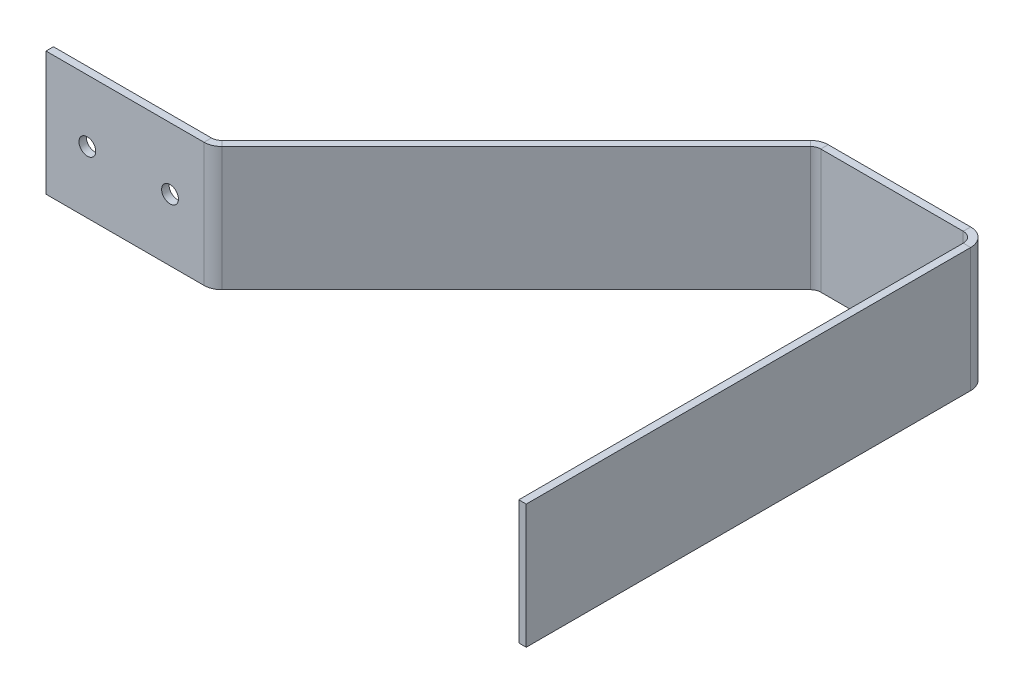
ISO-10303-21;
HEADER;
FILE_DESCRIPTION(('STEP AP214'),'2;1');
FILE_NAME('part.step','',(''),(''),'','','');
FILE_SCHEMA(('AUTOMOTIVE_DESIGN { 1 0 10303 214 1 1 1 1 }'));
ENDSEC;
DATA;
#1=APPLICATION_CONTEXT('core data for automotive mechanical design processes');
#2=APPLICATION_PROTOCOL_DEFINITION('international standard','automotive_design',2000,#1);
#3=PRODUCT_CONTEXT('',#1,'mechanical');
#4=PRODUCT('Part','Part','',(#3));
#5=PRODUCT_RELATED_PRODUCT_CATEGORY('part','',(#4));
#6=PRODUCT_DEFINITION_FORMATION('','',#4);
#7=PRODUCT_DEFINITION_CONTEXT('part definition',#1,'design');
#8=PRODUCT_DEFINITION('design','',#6,#7);
#9=PRODUCT_DEFINITION_SHAPE('','',#8);
#10=(LENGTH_UNIT() NAMED_UNIT(*) SI_UNIT(.MILLI.,.METRE.));
#11=(NAMED_UNIT(*) PLANE_ANGLE_UNIT() SI_UNIT($,.RADIAN.));
#12=(NAMED_UNIT(*) SI_UNIT($,.STERADIAN.) SOLID_ANGLE_UNIT());
#13=UNCERTAINTY_MEASURE_WITH_UNIT(LENGTH_MEASURE(1.E-05),#10,'distance_accuracy_value','');
#14=(GEOMETRIC_REPRESENTATION_CONTEXT(3) GLOBAL_UNCERTAINTY_ASSIGNED_CONTEXT((#13)) GLOBAL_UNIT_ASSIGNED_CONTEXT((#10,
#11,#12)) REPRESENTATION_CONTEXT('',''));
#15=CARTESIAN_POINT('',(0.,0.,0.));
#16=DIRECTION('',(0.,0.,1.));
#17=DIRECTION('',(1.,0.,0.));
#18=AXIS2_PLACEMENT_3D('',#15,#16,#17);
#19=CARTESIAN_POINT('',(48.5379797358805,38.1,0.));
#20=DIRECTION('',(0.,1.,0.));
#21=DIRECTION('',(0.,0.,1.));
#22=AXIS2_PLACEMENT_3D('',#19,#20,#21);
#23=PLANE('',#22);
#24=DIRECTION('',(0.,0.,-1.));
#25=VECTOR('',#24,1.);
#26=CARTESIAN_POINT('',(48.5379797358805,38.1,0.));
#27=LINE('',#26,#25);
#28=CARTESIAN_POINT('',(48.5379797358805,38.1,0.));
#29=VERTEX_POINT('',#28);
#30=CARTESIAN_POINT('',(48.5379797358805,38.1,-2.286));
#31=VERTEX_POINT('',#30);
#32=EDGE_CURVE('E11',#29,#31,#27,.T.);
#33=ORIENTED_EDGE('',*,*,#32,.F.);
#34=CARTESIAN_POINT('',(48.5379797358805,38.1,-5.461));
#35=DIRECTION('',(0.,-1.,0.));
#36=DIRECTION('',(0.,0.,-1.));
#37=AXIS2_PLACEMENT_3D('',#34,#35,#36);
#38=CIRCLE('',#37,5.461);
#39=CARTESIAN_POINT('',(52.3994898679403,38.1,-1.59948986794028));
#40=VERTEX_POINT('',#39);
#41=EDGE_CURVE('E336',#29,#40,#38,.F.);
#42=ORIENTED_EDGE('',*,*,#41,.T.);
#43=DIRECTION('',(0.707106781186549,0.,0.707106781186546));
#44=VECTOR('',#43,1.);
#45=CARTESIAN_POINT('',(50.7830437661478,38.1,-3.21593596973272));
#46=LINE('',#45,#44);
#47=CARTESIAN_POINT('',(50.7830437661478,38.1,-3.21593596973272));
#48=VERTEX_POINT('',#47);
#49=EDGE_CURVE('E47',#48,#40,#46,.T.);
#50=ORIENTED_EDGE('',*,*,#49,.F.);
#51=CARTESIAN_POINT('',(48.5379797358805,38.1,-5.461));
#52=DIRECTION('',(0.,1.,0.));
#53=DIRECTION('',(1.,0.,0.));
#54=AXIS2_PLACEMENT_3D('',#51,#52,#53);
#55=CIRCLE('',#54,3.175);
#56=EDGE_CURVE('E324',#31,#48,#55,.T.);
#57=ORIENTED_EDGE('',*,*,#56,.F.);
#58=EDGE_LOOP('',(#33,#42,#50,#57));
#59=FACE_BOUND('',#58,.T.);
#60=ADVANCED_FACE('F38',(#59),#23,.T.);
#61=CARTESIAN_POINT('',(50.7830437661478,38.1,-3.21593596973272));
#62=DIRECTION('',(0.,1.,0.));
#63=DIRECTION('',(0.,0.,1.));
#64=AXIS2_PLACEMENT_3D('',#61,#62,#63);
#65=PLANE('',#64);
#66=DIRECTION('',(1.,0.,0.));
#67=VECTOR('',#66,1.);
#68=CARTESIAN_POINT('',(0.,38.1,0.));
#69=LINE('',#68,#67);
#70=CARTESIAN_POINT('',(0.,38.1,0.));
#71=VERTEX_POINT('',#70);
#72=EDGE_CURVE('E333',#71,#29,#69,.T.);
#73=ORIENTED_EDGE('',*,*,#72,.T.);
#74=ORIENTED_EDGE('',*,*,#32,.T.);
#75=DIRECTION('',(1.,0.,0.));
#76=VECTOR('',#75,1.);
#77=CARTESIAN_POINT('',(0.,38.1,-2.286));
#78=LINE('',#77,#76);
#79=CARTESIAN_POINT('',(0.,38.1,-2.286));
#80=VERTEX_POINT('',#79);
#81=EDGE_CURVE('E327',#80,#31,#78,.T.);
#82=ORIENTED_EDGE('',*,*,#81,.F.);
#83=DIRECTION('',(0.,0.,-1.));
#84=VECTOR('',#83,1.);
#85=CARTESIAN_POINT('',(0.,38.1,0.));
#86=LINE('',#85,#84);
#87=EDGE_CURVE('E330',#71,#80,#86,.T.);
#88=ORIENTED_EDGE('',*,*,#87,.F.);
#89=EDGE_LOOP('',(#73,#74,#82,#88));
#90=FACE_BOUND('',#89,.T.);
#91=ADVANCED_FACE('F387',(#90),#65,.T.);
#92=CARTESIAN_POINT('',(52.3994898679403,0.,-1.59948986794028));
#93=DIRECTION('',(0.,-1.,0.));
#94=DIRECTION('',(0.,0.,-1.));
#95=AXIS2_PLACEMENT_3D('',#92,#93,#94);
#96=PLANE('',#95);
#97=DIRECTION('',(-0.707106781186549,0.,-0.707106781186546));
#98=VECTOR('',#97,1.);
#99=CARTESIAN_POINT('',(52.3994898679403,0.,-1.59948986794028));
#100=LINE('',#99,#98);
#101=CARTESIAN_POINT('',(52.3994898679403,0.,-1.59948986794028));
#102=VERTEX_POINT('',#101);
#103=CARTESIAN_POINT('',(50.7830437661478,0.,-3.21593596973272));
#104=VERTEX_POINT('',#103);
#105=EDGE_CURVE('E294',#102,#104,#100,.T.);
#106=ORIENTED_EDGE('',*,*,#105,.F.);
#107=CARTESIAN_POINT('',(48.5379797358805,0.,-5.461));
#108=DIRECTION('',(0.,-1.,0.));
#109=DIRECTION('',(0.,0.,-1.));
#110=AXIS2_PLACEMENT_3D('',#107,#108,#109);
#111=CIRCLE('',#110,5.461);
#112=CARTESIAN_POINT('',(48.5379797358805,0.,0.));
#113=VERTEX_POINT('',#112);
#114=EDGE_CURVE('E236',#113,#102,#111,.F.);
#115=ORIENTED_EDGE('',*,*,#114,.F.);
#116=DIRECTION('',(0.,0.,1.));
#117=VECTOR('',#116,1.);
#118=CARTESIAN_POINT('',(48.5379797358805,0.,-2.286));
#119=LINE('',#118,#117);
#120=CARTESIAN_POINT('',(48.5379797358805,0.,-2.286));
#121=VERTEX_POINT('',#120);
#122=EDGE_CURVE('E292',#121,#113,#119,.T.);
#123=ORIENTED_EDGE('',*,*,#122,.F.);
#124=CARTESIAN_POINT('',(48.5379797358805,0.,-5.461));
#125=DIRECTION('',(0.,1.,0.));
#126=DIRECTION('',(1.,0.,0.));
#127=AXIS2_PLACEMENT_3D('',#124,#125,#126);
#128=CIRCLE('',#127,3.175);
#129=EDGE_CURVE('E224',#121,#104,#128,.T.);
#130=ORIENTED_EDGE('',*,*,#129,.T.);
#131=EDGE_LOOP('',(#106,#115,#123,#130));
#132=FACE_BOUND('',#131,.T.);
#133=ADVANCED_FACE('F392',(#132),#96,.T.);
#134=CARTESIAN_POINT('',(48.5379797358805,0.,-2.286));
#135=DIRECTION('',(0.,-1.,0.));
#136=DIRECTION('',(0.,0.,-1.));
#137=AXIS2_PLACEMENT_3D('',#134,#135,#136);
#138=PLANE('',#137);
#139=DIRECTION('',(0.707106781186546,0.,-0.707106781186549));
#140=VECTOR('',#139,1.);
#141=CARTESIAN_POINT('',(50.8,0.,0.));
#142=LINE('',#141,#140);
#143=CARTESIAN_POINT('',(142.8070646762,0.,-92.0070646762005));
#144=VERTEX_POINT('',#143);
#145=EDGE_CURVE('E239',#102,#144,#142,.T.);
#146=ORIENTED_EDGE('',*,*,#145,.F.);
#147=ORIENTED_EDGE('',*,*,#105,.T.);
#148=DIRECTION('',(0.707106781186546,0.,-0.707106781186549));
#149=VECTOR('',#148,1.);
#150=CARTESIAN_POINT('',(49.1835538982075,0.,-1.61644610179244));
#151=LINE('',#150,#149);
#152=CARTESIAN_POINT('',(141.190618574408,0.,-93.6235107779929));
#153=VERTEX_POINT('',#152);
#154=EDGE_CURVE('E221',#104,#153,#151,.T.);
#155=ORIENTED_EDGE('',*,*,#154,.T.);
#156=DIRECTION('',(0.707106781186541,0.,0.707106781186554));
#157=VECTOR('',#156,1.);
#158=CARTESIAN_POINT('',(141.190618574408,0.,-93.6235107779929));
#159=LINE('',#158,#157);
#160=EDGE_CURVE('E288',#153,#144,#159,.T.);
#161=ORIENTED_EDGE('',*,*,#160,.T.);
#162=EDGE_LOOP('',(#146,#147,#155,#161));
#163=FACE_BOUND('',#162,.T.);
#164=ADVANCED_FACE('F409',(#163),#138,.T.);
#165=CARTESIAN_POINT('',(142.8070646762,38.1,-92.0070646762005));
#166=DIRECTION('',(0.,1.,0.));
#167=DIRECTION('',(0.,0.,1.));
#168=AXIS2_PLACEMENT_3D('',#165,#166,#167);
#169=PLANE('',#168);
#170=DIRECTION('',(-0.707106781186541,0.,-0.707106781186554));
#171=VECTOR('',#170,1.);
#172=CARTESIAN_POINT('',(142.8070646762,38.1,-92.0070646762005));
#173=LINE('',#172,#171);
#174=CARTESIAN_POINT('',(142.8070646762,38.1,-92.0070646762005));
#175=VERTEX_POINT('',#174);
#176=CARTESIAN_POINT('',(141.190618574408,38.1,-93.6235107779929));
#177=VERTEX_POINT('',#176);
#178=EDGE_CURVE('E173',#175,#177,#173,.T.);
#179=ORIENTED_EDGE('',*,*,#178,.F.);
#180=CARTESIAN_POINT('',(145.052128706467,38.1,-89.7620006459331));
#181=DIRECTION('',(0.,1.,0.));
#182=DIRECTION('',(0.,0.,1.));
#183=AXIS2_PLACEMENT_3D('',#180,#181,#182);
#184=CIRCLE('',#183,3.175);
#185=CARTESIAN_POINT('',(145.052128706467,38.1,-92.9370006459331));
#186=VERTEX_POINT('',#185);
#187=EDGE_CURVE('E177',#175,#186,#184,.F.);
#188=ORIENTED_EDGE('',*,*,#187,.T.);
#189=DIRECTION('',(0.,0.,1.));
#190=VECTOR('',#189,1.);
#191=CARTESIAN_POINT('',(145.052128706467,38.1,-95.2230006459331));
#192=LINE('',#191,#190);
#193=CARTESIAN_POINT('',(145.052128706467,38.1,-95.2230006459331));
#194=VERTEX_POINT('',#193);
#195=EDGE_CURVE('E161',#194,#186,#192,.T.);
#196=ORIENTED_EDGE('',*,*,#195,.F.);
#197=CARTESIAN_POINT('',(145.052128706467,38.1,-89.7620006459331));
#198=DIRECTION('',(0.,1.,0.));
#199=DIRECTION('',(1.,0.,0.));
#200=AXIS2_PLACEMENT_3D('',#197,#198,#199);
#201=CIRCLE('',#200,5.461);
#202=EDGE_CURVE('E319',#177,#194,#201,.F.);
#203=ORIENTED_EDGE('',*,*,#202,.F.);
#204=EDGE_LOOP('',(#179,#188,#196,#203));
#205=FACE_BOUND('',#204,.T.);
#206=ADVANCED_FACE('F179',(#205),#169,.T.);
#207=CARTESIAN_POINT('',(145.052128706467,38.1,-95.2230006459331));
#208=DIRECTION('',(0.,1.,0.));
#209=DIRECTION('',(0.,0.,1.));
#210=AXIS2_PLACEMENT_3D('',#207,#208,#209);
#211=PLANE('',#210);
#212=DIRECTION('',(0.707106781186546,0.,-0.707106781186549));
#213=VECTOR('',#212,1.);
#214=CARTESIAN_POINT('',(50.8,38.1,0.));
#215=LINE('',#214,#213);
#216=EDGE_CURVE('E183',#40,#175,#215,.T.);
#217=ORIENTED_EDGE('',*,*,#216,.T.);
#218=ORIENTED_EDGE('',*,*,#178,.T.);
#219=DIRECTION('',(0.707106781186546,0.,-0.707106781186549));
#220=VECTOR('',#219,1.);
#221=CARTESIAN_POINT('',(49.1835538982075,38.1,-1.61644610179244));
#222=LINE('',#221,#220);
#223=EDGE_CURVE('E321',#48,#177,#222,.T.);
#224=ORIENTED_EDGE('',*,*,#223,.F.);
#225=ORIENTED_EDGE('',*,*,#49,.T.);
#226=EDGE_LOOP('',(#217,#218,#224,#225));
#227=FACE_BOUND('',#226,.T.);
#228=ADVANCED_FACE('F341',(#227),#211,.T.);
#229=CARTESIAN_POINT('',(145.052128706467,0.,-92.9370006459331));
#230=DIRECTION('',(0.,-1.,0.));
#231=DIRECTION('',(0.,0.,-1.));
#232=AXIS2_PLACEMENT_3D('',#229,#230,#231);
#233=PLANE('',#232);
#234=DIRECTION('',(0.,0.,-1.));
#235=VECTOR('',#234,1.);
#236=CARTESIAN_POINT('',(145.052128706467,0.,-92.9370006459331));
#237=LINE('',#236,#235);
#238=CARTESIAN_POINT('',(145.052128706467,0.,-92.9370006459331));
#239=VERTEX_POINT('',#238);
#240=CARTESIAN_POINT('',(145.052128706467,0.,-95.2230006459331));
#241=VERTEX_POINT('',#240);
#242=EDGE_CURVE('E174',#239,#241,#237,.T.);
#243=ORIENTED_EDGE('',*,*,#242,.F.);
#244=CARTESIAN_POINT('',(145.052128706467,0.,-89.7620006459331));
#245=DIRECTION('',(0.,1.,0.));
#246=DIRECTION('',(0.,0.,1.));
#247=AXIS2_PLACEMENT_3D('',#244,#245,#246);
#248=CIRCLE('',#247,3.175);
#249=EDGE_CURVE('E190',#144,#239,#248,.F.);
#250=ORIENTED_EDGE('',*,*,#249,.F.);
#251=ORIENTED_EDGE('',*,*,#160,.F.);
#252=CARTESIAN_POINT('',(145.052128706467,0.,-89.7620006459331));
#253=DIRECTION('',(0.,1.,0.));
#254=DIRECTION('',(1.,0.,0.));
#255=AXIS2_PLACEMENT_3D('',#252,#253,#254);
#256=CIRCLE('',#255,5.461);
#257=EDGE_CURVE('E218',#153,#241,#256,.F.);
#258=ORIENTED_EDGE('',*,*,#257,.T.);
#259=EDGE_LOOP('',(#243,#250,#251,#258));
#260=FACE_BOUND('',#259,.T.);
#261=ADVANCED_FACE('F348',(#260),#233,.T.);
#262=CARTESIAN_POINT('',(141.190618574408,0.,-93.6235107779929));
#263=DIRECTION('',(0.,-1.,0.));
#264=DIRECTION('',(0.,0.,-1.));
#265=AXIS2_PLACEMENT_3D('',#262,#263,#264);
#266=PLANE('',#265);
#267=DIRECTION('',(1.,0.,0.));
#268=VECTOR('',#267,1.);
#269=CARTESIAN_POINT('',(143.737000645933,0.,-92.9370006459331));
#270=LINE('',#269,#268);
#271=CARTESIAN_POINT('',(188.822000645933,0.,-92.9370006459331));
#272=VERTEX_POINT('',#271);
#273=EDGE_CURVE('E243',#239,#272,#270,.T.);
#274=ORIENTED_EDGE('',*,*,#273,.F.);
#275=ORIENTED_EDGE('',*,*,#242,.T.);
#276=DIRECTION('',(1.,0.,0.));
#277=VECTOR('',#276,1.);
#278=CARTESIAN_POINT('',(143.737000645933,0.,-95.2230006459331));
#279=LINE('',#278,#277);
#280=CARTESIAN_POINT('',(188.822000645933,0.,-95.2230006459331));
#281=VERTEX_POINT('',#280);
#282=EDGE_CURVE('E216',#241,#281,#279,.T.);
#283=ORIENTED_EDGE('',*,*,#282,.T.);
#284=DIRECTION('',(0.,0.,1.));
#285=VECTOR('',#284,1.);
#286=CARTESIAN_POINT('',(188.822000645933,0.,-95.2230006459331));
#287=LINE('',#286,#285);
#288=EDGE_CURVE('E109',#281,#272,#287,.T.);
#289=ORIENTED_EDGE('',*,*,#288,.T.);
#290=EDGE_LOOP('',(#274,#275,#283,#289));
#291=FACE_BOUND('',#290,.T.);
#292=ADVANCED_FACE('F350',(#291),#266,.T.);
#293=CARTESIAN_POINT('',(188.822000645933,38.1,-92.9370006459331));
#294=DIRECTION('',(0.,1.,0.));
#295=DIRECTION('',(0.,0.,1.));
#296=AXIS2_PLACEMENT_3D('',#293,#294,#295);
#297=PLANE('',#296);
#298=DIRECTION('',(0.,0.,-1.));
#299=VECTOR('',#298,1.);
#300=CARTESIAN_POINT('',(188.822000645933,38.1,-92.9370006459331));
#301=LINE('',#300,#299);
#302=CARTESIAN_POINT('',(188.822000645933,38.1,-92.9370006459331));
#303=VERTEX_POINT('',#302);
#304=CARTESIAN_POINT('',(188.822000645933,38.1,-95.2230006459331));
#305=VERTEX_POINT('',#304);
#306=EDGE_CURVE('E286',#303,#305,#301,.T.);
#307=ORIENTED_EDGE('',*,*,#306,.F.);
#308=CARTESIAN_POINT('',(188.822000645933,38.1,-89.7620006459331));
#309=DIRECTION('',(0.,1.,0.));
#310=DIRECTION('',(0.,0.,1.));
#311=AXIS2_PLACEMENT_3D('',#308,#309,#310);
#312=CIRCLE('',#311,3.175);
#313=CARTESIAN_POINT('',(191.997000645933,38.1,-89.7620006459331));
#314=VERTEX_POINT('',#313);
#315=EDGE_CURVE('E198',#303,#314,#312,.F.);
#316=ORIENTED_EDGE('',*,*,#315,.T.);
#317=DIRECTION('',(-1.,0.,0.));
#318=VECTOR('',#317,1.);
#319=CARTESIAN_POINT('',(194.283000645933,38.1,-89.7620006459331));
#320=LINE('',#319,#318);
#321=CARTESIAN_POINT('',(194.283000645933,38.1,-89.7620006459331));
#322=VERTEX_POINT('',#321);
#323=EDGE_CURVE('E56',#322,#314,#320,.T.);
#324=ORIENTED_EDGE('',*,*,#323,.F.);
#325=CARTESIAN_POINT('',(188.822000645933,38.1,-89.7620006459331));
#326=DIRECTION('',(0.,1.,0.));
#327=DIRECTION('',(1.,0.,0.));
#328=AXIS2_PLACEMENT_3D('',#325,#326,#327);
#329=CIRCLE('',#328,5.461);
#330=EDGE_CURVE('E315',#305,#322,#329,.F.);
#331=ORIENTED_EDGE('',*,*,#330,.F.);
#332=EDGE_LOOP('',(#307,#316,#324,#331));
#333=FACE_BOUND('',#332,.T.);
#334=ADVANCED_FACE('F565',(#333),#297,.T.);
#335=CARTESIAN_POINT('',(194.283000645933,38.1,-89.7620006459331));
#336=DIRECTION('',(0.,1.,0.));
#337=DIRECTION('',(0.,0.,1.));
#338=AXIS2_PLACEMENT_3D('',#335,#336,#337);
#339=PLANE('',#338);
#340=DIRECTION('',(1.,0.,0.));
#341=VECTOR('',#340,1.);
#342=CARTESIAN_POINT('',(143.737000645933,38.1,-92.9370006459331));
#343=LINE('',#342,#341);
#344=EDGE_CURVE('E165',#186,#303,#343,.T.);
#345=ORIENTED_EDGE('',*,*,#344,.T.);
#346=ORIENTED_EDGE('',*,*,#306,.T.);
#347=DIRECTION('',(1.,0.,0.));
#348=VECTOR('',#347,1.);
#349=CARTESIAN_POINT('',(143.737000645933,38.1,-95.2230006459331));
#350=LINE('',#349,#348);
#351=EDGE_CURVE('E168',#194,#305,#350,.T.);
#352=ORIENTED_EDGE('',*,*,#351,.F.);
#353=ORIENTED_EDGE('',*,*,#195,.T.);
#354=EDGE_LOOP('',(#345,#346,#352,#353));
#355=FACE_BOUND('',#354,.T.);
#356=ADVANCED_FACE('F163',(#355),#339,.T.);
#357=CARTESIAN_POINT('',(191.997000645933,0.,-89.7620006459331));
#358=DIRECTION('',(0.,-1.,0.));
#359=DIRECTION('',(0.,0.,-1.));
#360=AXIS2_PLACEMENT_3D('',#357,#358,#359);
#361=PLANE('',#360);
#362=DIRECTION('',(1.,0.,0.));
#363=VECTOR('',#362,1.);
#364=CARTESIAN_POINT('',(191.997000645933,0.,-89.7620006459331));
#365=LINE('',#364,#363);
#366=CARTESIAN_POINT('',(191.997000645933,0.,-89.7620006459331));
#367=VERTEX_POINT('',#366);
#368=CARTESIAN_POINT('',(194.283000645933,0.,-89.7620006459331));
#369=VERTEX_POINT('',#368);
#370=EDGE_CURVE('E116',#367,#369,#365,.T.);
#371=ORIENTED_EDGE('',*,*,#370,.F.);
#372=CARTESIAN_POINT('',(188.822000645933,0.,-89.7620006459331));
#373=DIRECTION('',(0.,1.,0.));
#374=DIRECTION('',(0.,0.,1.));
#375=AXIS2_PLACEMENT_3D('',#372,#373,#374);
#376=CIRCLE('',#375,3.175);
#377=EDGE_CURVE('E245',#272,#367,#376,.F.);
#378=ORIENTED_EDGE('',*,*,#377,.F.);
#379=ORIENTED_EDGE('',*,*,#288,.F.);
#380=CARTESIAN_POINT('',(188.822000645933,0.,-89.7620006459331));
#381=DIRECTION('',(0.,1.,0.));
#382=DIRECTION('',(1.,0.,0.));
#383=AXIS2_PLACEMENT_3D('',#380,#381,#382);
#384=CIRCLE('',#383,5.461);
#385=EDGE_CURVE('E214',#281,#369,#384,.F.);
#386=ORIENTED_EDGE('',*,*,#385,.T.);
#387=EDGE_LOOP('',(#371,#378,#379,#386));
#388=FACE_BOUND('',#387,.T.);
#389=ADVANCED_FACE('F363',(#388),#361,.T.);
#390=CARTESIAN_POINT('',(188.822000645933,0.,-95.2230006459331));
#391=DIRECTION('',(0.,-1.,0.));
#392=DIRECTION('',(0.,0.,-1.));
#393=AXIS2_PLACEMENT_3D('',#390,#391,#392);
#394=PLANE('',#393);
#395=DIRECTION('',(0.,0.,1.));
#396=VECTOR('',#395,1.);
#397=CARTESIAN_POINT('',(191.997000645933,0.,-92.9370006459331));
#398=LINE('',#397,#396);
#399=CARTESIAN_POINT('',(191.997000645933,0.,46.7629993540669));
#400=VERTEX_POINT('',#399);
#401=EDGE_CURVE('E204',#367,#400,#398,.T.);
#402=ORIENTED_EDGE('',*,*,#401,.F.);
#403=ORIENTED_EDGE('',*,*,#370,.T.);
#404=DIRECTION('',(0.,0.,-1.));
#405=VECTOR('',#404,1.);
#406=CARTESIAN_POINT('',(194.283000645933,0.,-92.9370006459331));
#407=LINE('',#406,#405);
#408=CARTESIAN_POINT('',(194.283000645933,0.,46.7629993540669));
#409=VERTEX_POINT('',#408);
#410=EDGE_CURVE('E211',#369,#409,#407,.F.);
#411=ORIENTED_EDGE('',*,*,#410,.T.);
#412=DIRECTION('',(-1.,0.,0.));
#413=VECTOR('',#412,1.);
#414=CARTESIAN_POINT('',(194.283000645933,0.,46.7629993540669));
#415=LINE('',#414,#413);
#416=EDGE_CURVE('E207',#409,#400,#415,.T.);
#417=ORIENTED_EDGE('',*,*,#416,.T.);
#418=EDGE_LOOP('',(#402,#403,#411,#417));
#419=FACE_BOUND('',#418,.T.);
#420=ADVANCED_FACE('F371',(#419),#394,.T.);
#421=CARTESIAN_POINT('',(191.997000645933,38.1,-92.9370006459331));
#422=DIRECTION('',(1.,0.,0.));
#423=DIRECTION('',(0.,0.,-1.));
#424=AXIS2_PLACEMENT_3D('',#421,#422,#423);
#425=PLANE('',#424);
#426=ORIENTED_EDGE('',*,*,#401,.T.);
#427=DIRECTION('',(0.,-1.,0.));
#428=VECTOR('',#427,1.);
#429=CARTESIAN_POINT('',(191.997000645933,38.1,46.7629993540669));
#430=LINE('',#429,#428);
#431=CARTESIAN_POINT('',(191.997000645933,38.1,46.7629993540669));
#432=VERTEX_POINT('',#431);
#433=EDGE_CURVE('E281',#432,#400,#430,.T.);
#434=ORIENTED_EDGE('',*,*,#433,.F.);
#435=DIRECTION('',(0.,0.,1.));
#436=VECTOR('',#435,1.);
#437=CARTESIAN_POINT('',(191.997000645933,38.1,-92.9370006459331));
#438=LINE('',#437,#436);
#439=EDGE_CURVE('E122',#314,#432,#438,.T.);
#440=ORIENTED_EDGE('',*,*,#439,.F.);
#441=DIRECTION('',(0.,-1.,0.));
#442=VECTOR('',#441,1.);
#443=CARTESIAN_POINT('',(191.997000645933,38.1,-89.7620006459331));
#444=LINE('',#443,#442);
#445=EDGE_CURVE('E200',#314,#367,#444,.T.);
#446=ORIENTED_EDGE('',*,*,#445,.T.);
#447=EDGE_LOOP('',(#426,#434,#440,#446));
#448=FACE_BOUND('',#447,.T.);
#449=ADVANCED_FACE('F369',(#448),#425,.F.);
#450=CARTESIAN_POINT('',(194.283000645933,38.1,46.7629993540669));
#451=DIRECTION('',(0.,0.,1.));
#452=DIRECTION('',(1.,0.,0.));
#453=AXIS2_PLACEMENT_3D('',#450,#451,#452);
#454=PLANE('',#453);
#455=ORIENTED_EDGE('',*,*,#416,.F.);
#456=DIRECTION('',(0.,-1.,0.));
#457=VECTOR('',#456,1.);
#458=CARTESIAN_POINT('',(194.283000645933,38.1,46.7629993540669));
#459=LINE('',#458,#457);
#460=CARTESIAN_POINT('',(194.283000645933,38.1,46.7629993540669));
#461=VERTEX_POINT('',#460);
#462=EDGE_CURVE('E279',#461,#409,#459,.T.);
#463=ORIENTED_EDGE('',*,*,#462,.F.);
#464=DIRECTION('',(-1.,0.,0.));
#465=VECTOR('',#464,1.);
#466=CARTESIAN_POINT('',(194.283000645933,38.1,46.7629993540669));
#467=LINE('',#466,#465);
#468=EDGE_CURVE('E309',#461,#432,#467,.T.);
#469=ORIENTED_EDGE('',*,*,#468,.T.);
#470=ORIENTED_EDGE('',*,*,#433,.T.);
#471=EDGE_LOOP('',(#455,#463,#469,#470));
#472=FACE_BOUND('',#471,.T.);
#473=ADVANCED_FACE('F374',(#472),#454,.T.);
#474=CARTESIAN_POINT('',(194.283000645933,38.1,-92.9370006459331));
#475=DIRECTION('',(1.,0.,0.));
#476=DIRECTION('',(0.,0.,-1.));
#477=AXIS2_PLACEMENT_3D('',#474,#475,#476);
#478=PLANE('',#477);
#479=ORIENTED_EDGE('',*,*,#410,.F.);
#480=DIRECTION('',(0.,-1.,0.));
#481=VECTOR('',#480,1.);
#482=CARTESIAN_POINT('',(194.283000645933,38.1,-89.7620006459331));
#483=LINE('',#482,#481);
#484=EDGE_CURVE('E276',#322,#369,#483,.T.);
#485=ORIENTED_EDGE('',*,*,#484,.F.);
#486=DIRECTION('',(0.,0.,-1.));
#487=VECTOR('',#486,1.);
#488=CARTESIAN_POINT('',(194.283000645933,38.1,-92.9370006459331));
#489=LINE('',#488,#487);
#490=EDGE_CURVE('E312',#322,#461,#489,.F.);
#491=ORIENTED_EDGE('',*,*,#490,.T.);
#492=ORIENTED_EDGE('',*,*,#462,.T.);
#493=EDGE_LOOP('',(#479,#485,#491,#492));
#494=FACE_BOUND('',#493,.T.);
#495=ADVANCED_FACE('F377',(#494),#478,.T.);
#496=CARTESIAN_POINT('',(188.822000645933,38.1,-89.7620006459331));
#497=DIRECTION('',(0.,-1.,0.));
#498=DIRECTION('',(0.,0.,-1.));
#499=AXIS2_PLACEMENT_3D('',#496,#497,#498);
#500=CYLINDRICAL_SURFACE('',#499,5.461);
#501=ORIENTED_EDGE('',*,*,#385,.F.);
#502=DIRECTION('',(0.,-1.,0.));
#503=VECTOR('',#502,1.);
#504=CARTESIAN_POINT('',(188.822000645933,38.1,-95.2230006459331));
#505=LINE('',#504,#503);
#506=EDGE_CURVE('E273',#305,#281,#505,.T.);
#507=ORIENTED_EDGE('',*,*,#506,.F.);
#508=ORIENTED_EDGE('',*,*,#330,.T.);
#509=ORIENTED_EDGE('',*,*,#484,.T.);
#510=EDGE_LOOP('',(#501,#507,#508,#509));
#511=FACE_BOUND('',#510,.T.);
#512=ADVANCED_FACE('F360',(#511),#500,.T.);
#513=CARTESIAN_POINT('',(143.737000645933,38.1,-95.2230006459331));
#514=DIRECTION('',(0.,0.,-1.));
#515=DIRECTION('',(-1.,0.,0.));
#516=AXIS2_PLACEMENT_3D('',#513,#514,#515);
#517=PLANE('',#516);
#518=ORIENTED_EDGE('',*,*,#282,.F.);
#519=DIRECTION('',(0.,-1.,0.));
#520=VECTOR('',#519,1.);
#521=CARTESIAN_POINT('',(145.052128706467,38.1,-95.2230006459331));
#522=LINE('',#521,#520);
#523=EDGE_CURVE('E270',#194,#241,#522,.T.);
#524=ORIENTED_EDGE('',*,*,#523,.F.);
#525=ORIENTED_EDGE('',*,*,#351,.T.);
#526=ORIENTED_EDGE('',*,*,#506,.T.);
#527=EDGE_LOOP('',(#518,#524,#525,#526));
#528=FACE_BOUND('',#527,.T.);
#529=ADVANCED_FACE('F355',(#528),#517,.T.);
#530=CARTESIAN_POINT('',(145.052128706467,38.1,-89.7620006459331));
#531=DIRECTION('',(0.,-1.,0.));
#532=DIRECTION('',(0.,0.,-1.));
#533=AXIS2_PLACEMENT_3D('',#530,#531,#532);
#534=CYLINDRICAL_SURFACE('',#533,5.461);
#535=ORIENTED_EDGE('',*,*,#257,.F.);
#536=DIRECTION('',(0.,-1.,0.));
#537=VECTOR('',#536,1.);
#538=CARTESIAN_POINT('',(141.190618574408,38.1,-93.6235107779929));
#539=LINE('',#538,#537);
#540=EDGE_CURVE('E267',#177,#153,#539,.T.);
#541=ORIENTED_EDGE('',*,*,#540,.F.);
#542=ORIENTED_EDGE('',*,*,#202,.T.);
#543=ORIENTED_EDGE('',*,*,#523,.T.);
#544=EDGE_LOOP('',(#535,#541,#542,#543));
#545=FACE_BOUND('',#544,.T.);
#546=ADVANCED_FACE('F353',(#545),#534,.T.);
#547=CARTESIAN_POINT('',(49.1835538982075,38.1,-1.61644610179244));
#548=DIRECTION('',(-0.707106781186549,0.,-0.707106781186546));
#549=DIRECTION('',(-0.707106781186546,0.,0.707106781186549));
#550=AXIS2_PLACEMENT_3D('',#547,#548,#549);
#551=PLANE('',#550);
#552=ORIENTED_EDGE('',*,*,#154,.F.);
#553=DIRECTION('',(0.,-1.,0.));
#554=VECTOR('',#553,1.);
#555=CARTESIAN_POINT('',(50.7830437661478,38.1,-3.21593596973272));
#556=LINE('',#555,#554);
#557=EDGE_CURVE('E264',#48,#104,#556,.T.);
#558=ORIENTED_EDGE('',*,*,#557,.F.);
#559=ORIENTED_EDGE('',*,*,#223,.T.);
#560=ORIENTED_EDGE('',*,*,#540,.T.);
#561=EDGE_LOOP('',(#552,#558,#559,#560));
#562=FACE_BOUND('',#561,.T.);
#563=ADVANCED_FACE('F413',(#562),#551,.T.);
#564=CARTESIAN_POINT('',(48.5379797358805,38.1,-5.461));
#565=DIRECTION('',(0.,-1.,0.));
#566=DIRECTION('',(0.,0.,-1.));
#567=AXIS2_PLACEMENT_3D('',#564,#565,#566);
#568=CYLINDRICAL_SURFACE('',#567,3.175);
#569=ORIENTED_EDGE('',*,*,#129,.F.);
#570=DIRECTION('',(0.,-1.,0.));
#571=VECTOR('',#570,1.);
#572=CARTESIAN_POINT('',(48.5379797358805,38.1,-2.286));
#573=LINE('',#572,#571);
#574=EDGE_CURVE('E261',#31,#121,#573,.T.);
#575=ORIENTED_EDGE('',*,*,#574,.F.);
#576=ORIENTED_EDGE('',*,*,#56,.T.);
#577=ORIENTED_EDGE('',*,*,#557,.T.);
#578=EDGE_LOOP('',(#569,#575,#576,#577));
#579=FACE_BOUND('',#578,.T.);
#580=ADVANCED_FACE('F417',(#579),#568,.F.);
#581=CARTESIAN_POINT('',(0.,38.1,-2.286));
#582=DIRECTION('',(0.,0.,-1.));
#583=DIRECTION('',(-1.,0.,0.));
#584=AXIS2_PLACEMENT_3D('',#581,#582,#583);
#585=PLANE('',#584);
#586=CARTESIAN_POINT('',(38.1,19.05,-2.286));
#587=DIRECTION('',(0.,0.,-1.));
#588=DIRECTION('',(-1.,0.,0.));
#589=AXIS2_PLACEMENT_3D('',#586,#587,#588);
#590=CIRCLE('',#589,2.5796875);
#591=CARTESIAN_POINT('',(35.5203125,19.05,-2.286));
#592=VERTEX_POINT('',#591);
#593=EDGE_CURVE('E305',#592,#592,#590,.T.);
#594=ORIENTED_EDGE('',*,*,#593,.F.);
#595=EDGE_LOOP('',(#594));
#596=FACE_BOUND('',#595,.T.);
#597=CARTESIAN_POINT('',(12.7,19.05,-2.286));
#598=DIRECTION('',(0.,0.,-1.));
#599=DIRECTION('',(-1.,0.,0.));
#600=AXIS2_PLACEMENT_3D('',#597,#598,#599);
#601=CIRCLE('',#600,2.5796875);
#602=CARTESIAN_POINT('',(10.1203125,19.05,-2.286));
#603=VERTEX_POINT('',#602);
#604=EDGE_CURVE('E297',#603,#603,#601,.T.);
#605=ORIENTED_EDGE('',*,*,#604,.F.);
#606=EDGE_LOOP('',(#605));
#607=FACE_BOUND('',#606,.T.);
#608=DIRECTION('',(1.,0.,0.));
#609=VECTOR('',#608,1.);
#610=CARTESIAN_POINT('',(0.,0.,-2.286));
#611=LINE('',#610,#609);
#612=CARTESIAN_POINT('',(0.,0.,-2.286));
#613=VERTEX_POINT('',#612);
#614=EDGE_CURVE('E227',#613,#121,#611,.T.);
#615=ORIENTED_EDGE('',*,*,#614,.F.);
#616=DIRECTION('',(0.,-1.,0.));
#617=VECTOR('',#616,1.);
#618=CARTESIAN_POINT('',(0.,38.1,-2.286));
#619=LINE('',#618,#617);
#620=EDGE_CURVE('E259',#80,#613,#619,.T.);
#621=ORIENTED_EDGE('',*,*,#620,.F.);
#622=ORIENTED_EDGE('',*,*,#81,.T.);
#623=ORIENTED_EDGE('',*,*,#574,.T.);
#624=EDGE_LOOP('',(#615,#621,#622,#623));
#625=FACE_BOUND('',#624,.T.);
#626=ADVANCED_FACE('F423',(#596,#607,#625),#585,.T.);
#627=CARTESIAN_POINT('',(0.,38.1,0.));
#628=DIRECTION('',(-1.,0.,0.));
#629=DIRECTION('',(0.,0.,1.));
#630=AXIS2_PLACEMENT_3D('',#627,#628,#629);
#631=PLANE('',#630);
#632=DIRECTION('',(0.,0.,-1.));
#633=VECTOR('',#632,1.);
#634=CARTESIAN_POINT('',(0.,0.,0.));
#635=LINE('',#634,#633);
#636=CARTESIAN_POINT('',(0.,0.,0.));
#637=VERTEX_POINT('',#636);
#638=EDGE_CURVE('E230',#637,#613,#635,.T.);
#639=ORIENTED_EDGE('',*,*,#638,.F.);
#640=DIRECTION('',(0.,-1.,0.));
#641=VECTOR('',#640,1.);
#642=CARTESIAN_POINT('',(0.,38.1,0.));
#643=LINE('',#642,#641);
#644=EDGE_CURVE('E257',#71,#637,#643,.T.);
#645=ORIENTED_EDGE('',*,*,#644,.F.);
#646=ORIENTED_EDGE('',*,*,#87,.T.);
#647=ORIENTED_EDGE('',*,*,#620,.T.);
#648=EDGE_LOOP('',(#639,#645,#646,#647));
#649=FACE_BOUND('',#648,.T.);
#650=ADVANCED_FACE('F425',(#649),#631,.T.);
#651=CARTESIAN_POINT('',(0.,38.1,0.));
#652=DIRECTION('',(0.,0.,-1.));
#653=DIRECTION('',(-1.,0.,0.));
#654=AXIS2_PLACEMENT_3D('',#651,#652,#653);
#655=PLANE('',#654);
#656=CARTESIAN_POINT('',(38.1,19.05,0.));
#657=DIRECTION('',(0.,0.,-1.));
#658=DIRECTION('',(-1.,0.,0.));
#659=AXIS2_PLACEMENT_3D('',#656,#657,#658);
#660=CIRCLE('',#659,2.5796875);
#661=CARTESIAN_POINT('',(35.5203125,19.05,0.));
#662=VERTEX_POINT('',#661);
#663=EDGE_CURVE('E41',#662,#662,#660,.T.);
#664=ORIENTED_EDGE('',*,*,#663,.T.);
#665=EDGE_LOOP('',(#664));
#666=FACE_BOUND('',#665,.T.);
#667=CARTESIAN_POINT('',(12.7,19.05,0.));
#668=DIRECTION('',(0.,0.,-1.));
#669=DIRECTION('',(-1.,0.,0.));
#670=AXIS2_PLACEMENT_3D('',#667,#668,#669);
#671=CIRCLE('',#670,2.5796875);
#672=CARTESIAN_POINT('',(10.1203125,19.05,0.));
#673=VERTEX_POINT('',#672);
#674=EDGE_CURVE('E208',#673,#673,#671,.T.);
#675=ORIENTED_EDGE('',*,*,#674,.T.);
#676=EDGE_LOOP('',(#675));
#677=FACE_BOUND('',#676,.T.);
#678=DIRECTION('',(1.,0.,0.));
#679=VECTOR('',#678,1.);
#680=CARTESIAN_POINT('',(0.,0.,0.));
#681=LINE('',#680,#679);
#682=EDGE_CURVE('E233',#637,#113,#681,.T.);
#683=ORIENTED_EDGE('',*,*,#682,.T.);
#684=DIRECTION('',(0.,-1.,0.));
#685=VECTOR('',#684,1.);
#686=CARTESIAN_POINT('',(48.5379797358805,38.1,0.));
#687=LINE('',#686,#685);
#688=EDGE_CURVE('E254',#29,#113,#687,.T.);
#689=ORIENTED_EDGE('',*,*,#688,.F.);
#690=ORIENTED_EDGE('',*,*,#72,.F.);
#691=ORIENTED_EDGE('',*,*,#644,.T.);
#692=EDGE_LOOP('',(#683,#689,#690,#691));
#693=FACE_BOUND('',#692,.T.);
#694=ADVANCED_FACE('F403',(#666,#677,#693),#655,.F.);
#695=CARTESIAN_POINT('',(48.5379797358805,38.1,-5.461));
#696=DIRECTION('',(0.,-1.,0.));
#697=DIRECTION('',(0.,0.,-1.));
#698=AXIS2_PLACEMENT_3D('',#695,#696,#697);
#699=CYLINDRICAL_SURFACE('',#698,5.461);
#700=ORIENTED_EDGE('',*,*,#114,.T.);
#701=DIRECTION('',(0.,-1.,0.));
#702=VECTOR('',#701,1.);
#703=CARTESIAN_POINT('',(52.3994898679403,38.1,-1.59948986794028));
#704=LINE('',#703,#702);
#705=EDGE_CURVE('E251',#40,#102,#704,.T.);
#706=ORIENTED_EDGE('',*,*,#705,.F.);
#707=ORIENTED_EDGE('',*,*,#41,.F.);
#708=ORIENTED_EDGE('',*,*,#688,.T.);
#709=EDGE_LOOP('',(#700,#706,#707,#708));
#710=FACE_BOUND('',#709,.T.);
#711=ADVANCED_FACE('F407',(#710),#699,.T.);
#712=CARTESIAN_POINT('',(50.8,38.1,0.));
#713=DIRECTION('',(-0.707106781186549,0.,-0.707106781186546));
#714=DIRECTION('',(-0.707106781186546,0.,0.707106781186549));
#715=AXIS2_PLACEMENT_3D('',#712,#713,#714);
#716=PLANE('',#715);
#717=ORIENTED_EDGE('',*,*,#145,.T.);
#718=DIRECTION('',(0.,-1.,0.));
#719=VECTOR('',#718,1.);
#720=CARTESIAN_POINT('',(142.8070646762,38.1,-92.0070646762005));
#721=LINE('',#720,#719);
#722=EDGE_CURVE('E192',#175,#144,#721,.T.);
#723=ORIENTED_EDGE('',*,*,#722,.F.);
#724=ORIENTED_EDGE('',*,*,#216,.F.);
#725=ORIENTED_EDGE('',*,*,#705,.T.);
#726=EDGE_LOOP('',(#717,#723,#724,#725));
#727=FACE_BOUND('',#726,.T.);
#728=ADVANCED_FACE('F345',(#727),#716,.F.);
#729=CARTESIAN_POINT('',(145.052128706467,38.1,-89.7620006459331));
#730=DIRECTION('',(0.,-1.,0.));
#731=DIRECTION('',(0.,0.,-1.));
#732=AXIS2_PLACEMENT_3D('',#729,#730,#731);
#733=CYLINDRICAL_SURFACE('',#732,3.175);
#734=ORIENTED_EDGE('',*,*,#249,.T.);
#735=DIRECTION('',(0.,-1.,0.));
#736=VECTOR('',#735,1.);
#737=CARTESIAN_POINT('',(145.052128706467,38.1,-92.9370006459331));
#738=LINE('',#737,#736);
#739=EDGE_CURVE('E187',#186,#239,#738,.T.);
#740=ORIENTED_EDGE('',*,*,#739,.F.);
#741=ORIENTED_EDGE('',*,*,#187,.F.);
#742=ORIENTED_EDGE('',*,*,#722,.T.);
#743=EDGE_LOOP('',(#734,#740,#741,#742));
#744=FACE_BOUND('',#743,.T.);
#745=ADVANCED_FACE('F188',(#744),#733,.F.);
#746=CARTESIAN_POINT('',(143.737000645933,38.1,-92.9370006459331));
#747=DIRECTION('',(0.,0.,-1.));
#748=DIRECTION('',(-1.,0.,0.));
#749=AXIS2_PLACEMENT_3D('',#746,#747,#748);
#750=PLANE('',#749);
#751=ORIENTED_EDGE('',*,*,#273,.T.);
#752=DIRECTION('',(0.,-1.,0.));
#753=VECTOR('',#752,1.);
#754=CARTESIAN_POINT('',(188.822000645933,38.1,-92.9370006459331));
#755=LINE('',#754,#753);
#756=EDGE_CURVE('E193',#303,#272,#755,.T.);
#757=ORIENTED_EDGE('',*,*,#756,.F.);
#758=ORIENTED_EDGE('',*,*,#344,.F.);
#759=ORIENTED_EDGE('',*,*,#739,.T.);
#760=EDGE_LOOP('',(#751,#757,#758,#759));
#761=FACE_BOUND('',#760,.T.);
#762=ADVANCED_FACE('F195',(#761),#750,.F.);
#763=CARTESIAN_POINT('',(188.822000645933,38.1,-89.7620006459331));
#764=DIRECTION('',(0.,-1.,0.));
#765=DIRECTION('',(0.,0.,-1.));
#766=AXIS2_PLACEMENT_3D('',#763,#764,#765);
#767=CYLINDRICAL_SURFACE('',#766,3.175);
#768=ORIENTED_EDGE('',*,*,#377,.T.);
#769=ORIENTED_EDGE('',*,*,#445,.F.);
#770=ORIENTED_EDGE('',*,*,#315,.F.);
#771=ORIENTED_EDGE('',*,*,#756,.T.);
#772=EDGE_LOOP('',(#768,#769,#770,#771));
#773=FACE_BOUND('',#772,.T.);
#774=ADVANCED_FACE('F366',(#773),#767,.F.);
#775=CARTESIAN_POINT('',(188.822000645933,38.1,-89.7620006459331));
#776=DIRECTION('',(0.,1.,0.));
#777=DIRECTION('',(1.,0.,0.));
#778=AXIS2_PLACEMENT_3D('',#775,#776,#777);
#779=PLANE('',#778);
#780=ORIENTED_EDGE('',*,*,#439,.T.);
#781=ORIENTED_EDGE('',*,*,#468,.F.);
#782=ORIENTED_EDGE('',*,*,#490,.F.);
#783=ORIENTED_EDGE('',*,*,#323,.T.);
#784=EDGE_LOOP('',(#780,#781,#782,#783));
#785=FACE_BOUND('',#784,.T.);
#786=ADVANCED_FACE('F375',(#785),#779,.T.);
#787=CARTESIAN_POINT('',(188.822000645933,0.,-89.7620006459331));
#788=DIRECTION('',(0.,1.,0.));
#789=DIRECTION('',(1.,0.,0.));
#790=AXIS2_PLACEMENT_3D('',#787,#788,#789);
#791=PLANE('',#790);
#792=ORIENTED_EDGE('',*,*,#614,.T.);
#793=ORIENTED_EDGE('',*,*,#122,.T.);
#794=ORIENTED_EDGE('',*,*,#682,.F.);
#795=ORIENTED_EDGE('',*,*,#638,.T.);
#796=EDGE_LOOP('',(#792,#793,#794,#795));
#797=FACE_BOUND('',#796,.T.);
#798=ADVANCED_FACE('F420',(#797),#791,.F.);
#799=CARTESIAN_POINT('',(12.7,19.05,46.7629993540669));
#800=DIRECTION('',(0.,0.,-1.));
#801=DIRECTION('',(-1.,0.,0.));
#802=AXIS2_PLACEMENT_3D('',#799,#800,#801);
#803=CYLINDRICAL_SURFACE('',#802,2.5796875);
#804=ORIENTED_EDGE('',*,*,#604,.T.);
#805=EDGE_LOOP('',(#804));
#806=FACE_BOUND('',#805,.T.);
#807=ORIENTED_EDGE('',*,*,#674,.F.);
#808=EDGE_LOOP('',(#807));
#809=FACE_BOUND('',#808,.T.);
#810=ADVANCED_FACE('F486',(#806,#809),#803,.F.);
#811=CARTESIAN_POINT('',(38.1,19.05,46.7629993540669));
#812=DIRECTION('',(0.,0.,-1.));
#813=DIRECTION('',(-1.,0.,0.));
#814=AXIS2_PLACEMENT_3D('',#811,#812,#813);
#815=CYLINDRICAL_SURFACE('',#814,2.5796875);
#816=ORIENTED_EDGE('',*,*,#593,.T.);
#817=EDGE_LOOP('',(#816));
#818=FACE_BOUND('',#817,.T.);
#819=ORIENTED_EDGE('',*,*,#663,.F.);
#820=EDGE_LOOP('',(#819));
#821=FACE_BOUND('',#820,.T.);
#822=ADVANCED_FACE('F491',(#818,#821),#815,.F.);
#823=CLOSED_SHELL('',(#60,#91,#133,#164,#206,#228,#261,#292,#334,#356,#389,#420,#449,#473,#495,
#512,#529,#546,#563,#580,#626,#650,#694,#711,#728,#745,#762,#774,#786,#798,#810,#822));
#824=MANIFOLD_SOLID_BREP('B2',#823);
#825=ADVANCED_BREP_SHAPE_REPRESENTATION('',(#18,#824),#14);
#826=SHAPE_DEFINITION_REPRESENTATION(#9,#825);
ENDSEC;
END-ISO-10303-21;
